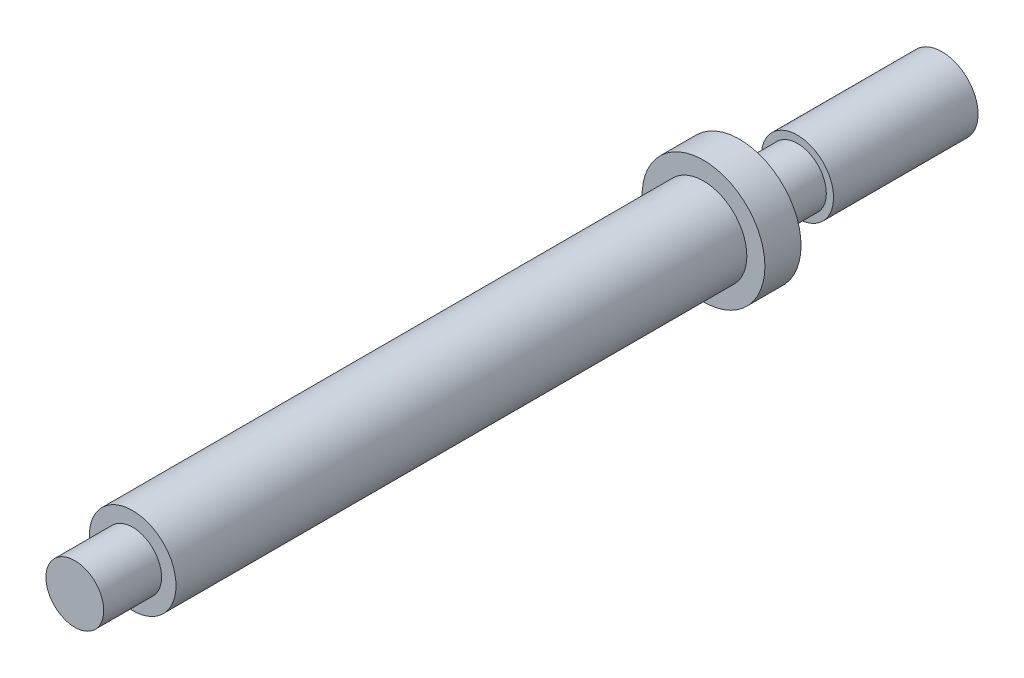
ISO-10303-21;
HEADER;
FILE_DESCRIPTION(('STEP AP214'),'2;1');
FILE_NAME('part.step','',(''),(''),'','','');
FILE_SCHEMA(('AUTOMOTIVE_DESIGN { 1 0 10303 214 1 1 1 1 }'));
ENDSEC;
DATA;
#1=APPLICATION_CONTEXT('core data for automotive mechanical design processes');
#2=APPLICATION_PROTOCOL_DEFINITION('international standard','automotive_design',2000,#1);
#3=PRODUCT_CONTEXT('',#1,'mechanical');
#4=PRODUCT('Part','Part','',(#3));
#5=PRODUCT_RELATED_PRODUCT_CATEGORY('part','',(#4));
#6=PRODUCT_DEFINITION_FORMATION('','',#4);
#7=PRODUCT_DEFINITION_CONTEXT('part definition',#1,'design');
#8=PRODUCT_DEFINITION('design','',#6,#7);
#9=PRODUCT_DEFINITION_SHAPE('','',#8);
#10=(LENGTH_UNIT() NAMED_UNIT(*) SI_UNIT(.MILLI.,.METRE.));
#11=(NAMED_UNIT(*) PLANE_ANGLE_UNIT() SI_UNIT($,.RADIAN.));
#12=(NAMED_UNIT(*) SI_UNIT($,.STERADIAN.) SOLID_ANGLE_UNIT());
#13=UNCERTAINTY_MEASURE_WITH_UNIT(LENGTH_MEASURE(1.E-05),#10,'distance_accuracy_value','');
#14=(GEOMETRIC_REPRESENTATION_CONTEXT(3) GLOBAL_UNCERTAINTY_ASSIGNED_CONTEXT((#13)) GLOBAL_UNIT_ASSIGNED_CONTEXT((#10,
#11,#12)) REPRESENTATION_CONTEXT('',''));
#15=CARTESIAN_POINT('',(0.,0.,0.));
#16=DIRECTION('',(0.,0.,1.));
#17=DIRECTION('',(1.,0.,0.));
#18=AXIS2_PLACEMENT_3D('',#15,#16,#17);
#19=CARTESIAN_POINT('',(0.,0.,0.));
#20=DIRECTION('',(0.,0.,-1.));
#21=DIRECTION('',(-1.,0.,0.));
#22=AXIS2_PLACEMENT_3D('',#19,#20,#21);
#23=PLANE('',#22);
#24=CARTESIAN_POINT('',(0.,0.,0.));
#25=DIRECTION('',(0.,0.,1.));
#26=DIRECTION('',(1.,0.,0.));
#27=AXIS2_PLACEMENT_3D('',#24,#25,#26);
#28=CIRCLE('',#27,4.);
#29=CARTESIAN_POINT('',(4.,0.,0.));
#30=VERTEX_POINT('',#29);
#31=EDGE_CURVE('E10',#30,#30,#28,.T.);
#32=ORIENTED_EDGE('',*,*,#31,.T.);
#33=EDGE_LOOP('',(#32));
#34=FACE_BOUND('',#33,.T.);
#35=ADVANCED_FACE('F48',(#34),#23,.F.);
#36=CARTESIAN_POINT('',(0.,0.,0.));
#37=DIRECTION('',(0.,0.,1.));
#38=DIRECTION('',(1.,0.,0.));
#39=AXIS2_PLACEMENT_3D('',#36,#37,#38);
#40=CYLINDRICAL_SURFACE('',#39,4.);
#41=ORIENTED_EDGE('',*,*,#31,.F.);
#42=EDGE_LOOP('',(#41));
#43=FACE_BOUND('',#42,.T.);
#44=CARTESIAN_POINT('',(0.,0.,-8.));
#45=DIRECTION('',(0.,0.,1.));
#46=DIRECTION('',(1.,0.,0.));
#47=AXIS2_PLACEMENT_3D('',#44,#45,#46);
#48=CIRCLE('',#47,4.);
#49=CARTESIAN_POINT('',(4.,0.,-8.));
#50=VERTEX_POINT('',#49);
#51=EDGE_CURVE('E55',#50,#50,#48,.T.);
#52=ORIENTED_EDGE('',*,*,#51,.T.);
#53=EDGE_LOOP('',(#52));
#54=FACE_BOUND('',#53,.T.);
#55=ADVANCED_FACE('F115',(#43,#54),#40,.T.);
#56=CARTESIAN_POINT('',(0.,4.,-8.));
#57=DIRECTION('',(0.,0.,-1.));
#58=DIRECTION('',(-1.,0.,0.));
#59=AXIS2_PLACEMENT_3D('',#56,#57,#58);
#60=PLANE('',#59);
#61=ORIENTED_EDGE('',*,*,#51,.F.);
#62=EDGE_LOOP('',(#61));
#63=FACE_BOUND('',#62,.T.);
#64=CARTESIAN_POINT('',(0.,0.,-8.));
#65=DIRECTION('',(0.,0.,1.));
#66=DIRECTION('',(1.,0.,0.));
#67=AXIS2_PLACEMENT_3D('',#64,#65,#66);
#68=CIRCLE('',#67,6.);
#69=CARTESIAN_POINT('',(6.,0.,-8.));
#70=VERTEX_POINT('',#69);
#71=EDGE_CURVE('E61',#70,#70,#68,.T.);
#72=ORIENTED_EDGE('',*,*,#71,.T.);
#73=EDGE_LOOP('',(#72));
#74=FACE_BOUND('',#73,.T.);
#75=ADVANCED_FACE('F119',(#63,#74),#60,.F.);
#76=CARTESIAN_POINT('',(0.,0.,0.));
#77=DIRECTION('',(0.,0.,1.));
#78=DIRECTION('',(1.,0.,0.));
#79=AXIS2_PLACEMENT_3D('',#76,#77,#78);
#80=CYLINDRICAL_SURFACE('',#79,6.);
#81=ORIENTED_EDGE('',*,*,#71,.F.);
#82=EDGE_LOOP('',(#81));
#83=FACE_BOUND('',#82,.T.);
#84=CARTESIAN_POINT('',(0.,0.,-87.));
#85=DIRECTION('',(0.,0.,1.));
#86=DIRECTION('',(1.,0.,0.));
#87=AXIS2_PLACEMENT_3D('',#84,#85,#86);
#88=CIRCLE('',#87,6.);
#89=CARTESIAN_POINT('',(6.,0.,-87.));
#90=VERTEX_POINT('',#89);
#91=EDGE_CURVE('E68',#90,#90,#88,.T.);
#92=ORIENTED_EDGE('',*,*,#91,.T.);
#93=EDGE_LOOP('',(#92));
#94=FACE_BOUND('',#93,.T.);
#95=ADVANCED_FACE('F124',(#83,#94),#80,.T.);
#96=CARTESIAN_POINT('',(0.,6.,-87.));
#97=DIRECTION('',(0.,0.,-1.));
#98=DIRECTION('',(-1.,0.,0.));
#99=AXIS2_PLACEMENT_3D('',#96,#97,#98);
#100=PLANE('',#99);
#101=ORIENTED_EDGE('',*,*,#91,.F.);
#102=EDGE_LOOP('',(#101));
#103=FACE_BOUND('',#102,.T.);
#104=CARTESIAN_POINT('',(0.,0.,-87.));
#105=DIRECTION('',(0.,0.,1.));
#106=DIRECTION('',(1.,0.,0.));
#107=AXIS2_PLACEMENT_3D('',#104,#105,#106);
#108=CIRCLE('',#107,8.5);
#109=CARTESIAN_POINT('',(8.5,0.,-87.));
#110=VERTEX_POINT('',#109);
#111=EDGE_CURVE('E74',#110,#110,#108,.T.);
#112=ORIENTED_EDGE('',*,*,#111,.T.);
#113=EDGE_LOOP('',(#112));
#114=FACE_BOUND('',#113,.T.);
#115=ADVANCED_FACE('F130',(#103,#114),#100,.F.);
#116=CARTESIAN_POINT('',(0.,0.,0.));
#117=DIRECTION('',(0.,0.,1.));
#118=DIRECTION('',(1.,0.,0.));
#119=AXIS2_PLACEMENT_3D('',#116,#117,#118);
#120=CYLINDRICAL_SURFACE('',#119,8.5);
#121=ORIENTED_EDGE('',*,*,#111,.F.);
#122=EDGE_LOOP('',(#121));
#123=FACE_BOUND('',#122,.T.);
#124=CARTESIAN_POINT('',(0.,0.,-92.));
#125=DIRECTION('',(0.,0.,1.));
#126=DIRECTION('',(1.,0.,0.));
#127=AXIS2_PLACEMENT_3D('',#124,#125,#126);
#128=CIRCLE('',#127,8.5);
#129=CARTESIAN_POINT('',(8.5,0.,-92.));
#130=VERTEX_POINT('',#129);
#131=EDGE_CURVE('E77',#130,#130,#128,.T.);
#132=ORIENTED_EDGE('',*,*,#131,.T.);
#133=EDGE_LOOP('',(#132));
#134=FACE_BOUND('',#133,.T.);
#135=ADVANCED_FACE('F134',(#123,#134),#120,.T.);
#136=CARTESIAN_POINT('',(0.,8.5,-92.));
#137=DIRECTION('',(0.,0.,1.));
#138=DIRECTION('',(1.,0.,0.));
#139=AXIS2_PLACEMENT_3D('',#136,#137,#138);
#140=PLANE('',#139);
#141=ORIENTED_EDGE('',*,*,#131,.F.);
#142=EDGE_LOOP('',(#141));
#143=FACE_BOUND('',#142,.T.);
#144=CARTESIAN_POINT('',(0.,0.,-92.));
#145=DIRECTION('',(0.,0.,1.));
#146=DIRECTION('',(1.,0.,0.));
#147=AXIS2_PLACEMENT_3D('',#144,#145,#146);
#148=CIRCLE('',#147,4.);
#149=CARTESIAN_POINT('',(4.,0.,-92.));
#150=VERTEX_POINT('',#149);
#151=EDGE_CURVE('E81',#150,#150,#148,.T.);
#152=ORIENTED_EDGE('',*,*,#151,.T.);
#153=EDGE_LOOP('',(#152));
#154=FACE_BOUND('',#153,.T.);
#155=ADVANCED_FACE('F138',(#143,#154),#140,.F.);
#156=CARTESIAN_POINT('',(0.,0.,0.));
#157=DIRECTION('',(0.,0.,1.));
#158=DIRECTION('',(1.,0.,0.));
#159=AXIS2_PLACEMENT_3D('',#156,#157,#158);
#160=CYLINDRICAL_SURFACE('',#159,4.);
#161=ORIENTED_EDGE('',*,*,#151,.F.);
#162=EDGE_LOOP('',(#161));
#163=FACE_BOUND('',#162,.T.);
#164=CARTESIAN_POINT('',(0.,0.,-100.));
#165=DIRECTION('',(0.,0.,1.));
#166=DIRECTION('',(1.,0.,0.));
#167=AXIS2_PLACEMENT_3D('',#164,#165,#166);
#168=CIRCLE('',#167,4.);
#169=CARTESIAN_POINT('',(4.,0.,-100.));
#170=VERTEX_POINT('',#169);
#171=EDGE_CURVE('E84',#170,#170,#168,.T.);
#172=ORIENTED_EDGE('',*,*,#171,.T.);
#173=EDGE_LOOP('',(#172));
#174=FACE_BOUND('',#173,.T.);
#175=ADVANCED_FACE('F101',(#163,#174),#160,.T.);
#176=CARTESIAN_POINT('',(0.,0.,-120.));
#177=DIRECTION('',(0.,0.,1.));
#178=DIRECTION('',(1.,0.,0.));
#179=AXIS2_PLACEMENT_3D('',#176,#177,#178);
#180=CYLINDRICAL_SURFACE('',#179,5.);
#181=CARTESIAN_POINT('',(0.,0.,-120.));
#182=DIRECTION('',(0.,0.,-1.));
#183=DIRECTION('',(-1.,0.,0.));
#184=AXIS2_PLACEMENT_3D('',#181,#182,#183);
#185=CIRCLE('',#184,5.);
#186=CARTESIAN_POINT('',(-5.,0.,-120.));
#187=VERTEX_POINT('',#186);
#188=EDGE_CURVE('E88',#187,#187,#185,.T.);
#189=ORIENTED_EDGE('',*,*,#188,.F.);
#190=EDGE_LOOP('',(#189));
#191=FACE_BOUND('',#190,.T.);
#192=CARTESIAN_POINT('',(0.,0.,-100.));
#193=DIRECTION('',(0.,0.,-1.));
#194=DIRECTION('',(-1.,0.,0.));
#195=AXIS2_PLACEMENT_3D('',#192,#193,#194);
#196=CIRCLE('',#195,5.);
#197=CARTESIAN_POINT('',(-5.,0.,-100.));
#198=VERTEX_POINT('',#197);
#199=EDGE_CURVE('E89',#198,#198,#196,.T.);
#200=ORIENTED_EDGE('',*,*,#199,.T.);
#201=EDGE_LOOP('',(#200));
#202=FACE_BOUND('',#201,.T.);
#203=ADVANCED_FACE('F98',(#191,#202),#180,.T.);
#204=CARTESIAN_POINT('',(0.,0.,-120.));
#205=DIRECTION('',(0.,0.,-1.));
#206=DIRECTION('',(-1.,0.,0.));
#207=AXIS2_PLACEMENT_3D('',#204,#205,#206);
#208=PLANE('',#207);
#209=ORIENTED_EDGE('',*,*,#188,.T.);
#210=EDGE_LOOP('',(#209));
#211=FACE_BOUND('',#210,.T.);
#212=ADVANCED_FACE('F96',(#211),#208,.T.);
#213=CARTESIAN_POINT('',(0.,0.,-100.));
#214=DIRECTION('',(0.,0.,-1.));
#215=DIRECTION('',(-1.,0.,0.));
#216=AXIS2_PLACEMENT_3D('',#213,#214,#215);
#217=PLANE('',#216);
#218=ORIENTED_EDGE('',*,*,#171,.F.);
#219=EDGE_LOOP('',(#218));
#220=FACE_BOUND('',#219,.T.);
#221=ORIENTED_EDGE('',*,*,#199,.F.);
#222=EDGE_LOOP('',(#221));
#223=FACE_BOUND('',#222,.T.);
#224=ADVANCED_FACE('F105',(#220,#223),#217,.F.);
#225=CLOSED_SHELL('',(#35,#55,#75,#95,#115,#135,#155,#175,#203,#212,#224));
#226=MANIFOLD_SOLID_BREP('B2',#225);
#227=ADVANCED_BREP_SHAPE_REPRESENTATION('',(#18,#226),#14);
#228=SHAPE_DEFINITION_REPRESENTATION(#9,#227);
ENDSEC;
END-ISO-10303-21;
